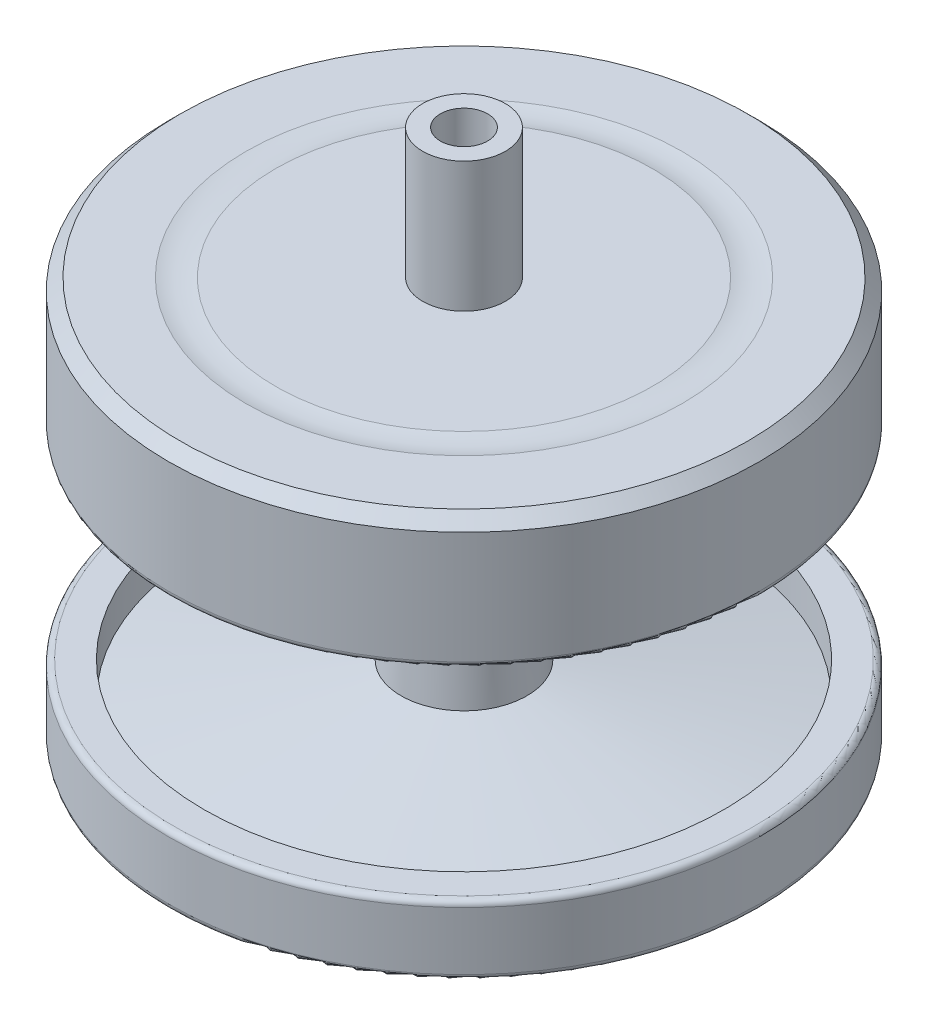
ISO-10303-21;
HEADER;
FILE_DESCRIPTION(('STEP AP214'),'2;1');
FILE_NAME('part.step','',(''),(''),'','','');
FILE_SCHEMA(('AUTOMOTIVE_DESIGN { 1 0 10303 214 1 1 1 1 }'));
ENDSEC;
DATA;
#1=APPLICATION_CONTEXT('core data for automotive mechanical design processes');
#2=APPLICATION_PROTOCOL_DEFINITION('international standard','automotive_design',2000,#1);
#3=PRODUCT_CONTEXT('',#1,'mechanical');
#4=PRODUCT('Part','Part','',(#3));
#5=PRODUCT_RELATED_PRODUCT_CATEGORY('part','',(#4));
#6=PRODUCT_DEFINITION_FORMATION('','',#4);
#7=PRODUCT_DEFINITION_CONTEXT('part definition',#1,'design');
#8=PRODUCT_DEFINITION('design','',#6,#7);
#9=PRODUCT_DEFINITION_SHAPE('','',#8);
#10=(LENGTH_UNIT() NAMED_UNIT(*) SI_UNIT(.MILLI.,.METRE.));
#11=(NAMED_UNIT(*) PLANE_ANGLE_UNIT() SI_UNIT($,.RADIAN.));
#12=(NAMED_UNIT(*) SI_UNIT($,.STERADIAN.) SOLID_ANGLE_UNIT());
#13=UNCERTAINTY_MEASURE_WITH_UNIT(LENGTH_MEASURE(1.E-05),#10,'distance_accuracy_value','');
#14=(GEOMETRIC_REPRESENTATION_CONTEXT(3) GLOBAL_UNCERTAINTY_ASSIGNED_CONTEXT((#13)) GLOBAL_UNIT_ASSIGNED_CONTEXT((#10,
#11,#12)) REPRESENTATION_CONTEXT('',''));
#15=CARTESIAN_POINT('',(0.,0.,0.));
#16=DIRECTION('',(0.,0.,1.));
#17=DIRECTION('',(1.,0.,0.));
#18=AXIS2_PLACEMENT_3D('',#15,#16,#17);
#19=CARTESIAN_POINT('',(3.5,-11.,0.));
#20=DIRECTION('',(0.,-1.,0.));
#21=DIRECTION('',(0.,0.,-1.));
#22=AXIS2_PLACEMENT_3D('',#19,#20,#21);
#23=PLANE('',#22);
#24=CARTESIAN_POINT('',(0.,-11.,0.));
#25=DIRECTION('',(0.,1.,0.));
#26=DIRECTION('',(-1.,0.,0.));
#27=AXIS2_PLACEMENT_3D('',#24,#25,#26);
#28=CIRCLE('',#27,18.4735290069585);
#29=CARTESIAN_POINT('',(-18.4735290069585,-11.,0.));
#30=VERTEX_POINT('',#29);
#31=EDGE_CURVE('E78',#30,#30,#28,.T.);
#32=ORIENTED_EDGE('',*,*,#31,.F.);
#33=EDGE_LOOP('',(#32));
#34=FACE_BOUND('',#33,.T.);
#35=CARTESIAN_POINT('',(0.,-11.,0.));
#36=DIRECTION('',(0.,1.,0.));
#37=DIRECTION('',(-1.,0.,0.));
#38=AXIS2_PLACEMENT_3D('',#35,#36,#37);
#39=CIRCLE('',#38,24.);
#40=CARTESIAN_POINT('',(-24.,-11.,0.));
#41=VERTEX_POINT('',#40);
#42=EDGE_CURVE('E136',#41,#41,#39,.T.);
#43=ORIENTED_EDGE('',*,*,#42,.T.);
#44=EDGE_LOOP('',(#43));
#45=FACE_BOUND('',#44,.T.);
#46=ADVANCED_FACE('F40',(#34,#45),#23,.F.);
#47=CARTESIAN_POINT('',(0.,0.,0.));
#48=DIRECTION('',(0.,1.,0.));
#49=DIRECTION('',(0.,0.,1.));
#50=AXIS2_PLACEMENT_3D('',#47,#48,#49);
#51=CYLINDRICAL_SURFACE('',#50,25.);
#52=CARTESIAN_POINT('',(0.,-21.5,0.));
#53=DIRECTION('',(0.,1.,0.));
#54=DIRECTION('',(0.,0.,1.));
#55=AXIS2_PLACEMENT_3D('',#52,#53,#54);
#56=CIRCLE('',#55,25.);
#57=CARTESIAN_POINT('',(0.,-21.5,25.));
#58=VERTEX_POINT('',#57);
#59=EDGE_CURVE('E48',#58,#58,#56,.T.);
#60=ORIENTED_EDGE('',*,*,#59,.T.);
#61=EDGE_LOOP('',(#60));
#62=FACE_BOUND('',#61,.T.);
#63=CARTESIAN_POINT('',(0.,-12.,0.));
#64=DIRECTION('',(0.,1.,0.));
#65=DIRECTION('',(-1.,0.,0.));
#66=AXIS2_PLACEMENT_3D('',#63,#64,#65);
#67=CIRCLE('',#66,25.);
#68=CARTESIAN_POINT('',(-25.,-12.,0.));
#69=VERTEX_POINT('',#68);
#70=EDGE_CURVE('E132',#69,#69,#67,.T.);
#71=ORIENTED_EDGE('',*,*,#70,.F.);
#72=EDGE_LOOP('',(#71));
#73=FACE_BOUND('',#72,.T.);
#74=ADVANCED_FACE('F159',(#62,#73),#51,.T.);
#75=CARTESIAN_POINT('',(0.,-11.,0.));
#76=DIRECTION('',(0.,1.,0.));
#77=DIRECTION('',(0.,0.,1.));
#78=AXIS2_PLACEMENT_3D('',#75,#76,#77);
#79=CIRCLE('',#78,3.5);
#80=CARTESIAN_POINT('',(0.,-11.,3.5));
#81=VERTEX_POINT('',#80);
#82=EDGE_CURVE('E82',#81,#81,#79,.T.);
#83=ORIENTED_EDGE('',*,*,#82,.F.);
#84=EDGE_LOOP('',(#83));
#85=FACE_BOUND('',#84,.T.);
#86=CARTESIAN_POINT('',(0.,-11.,0.));
#87=DIRECTION('',(0.,1.,0.));
#88=DIRECTION('',(-1.,0.,0.));
#89=AXIS2_PLACEMENT_3D('',#86,#87,#88);
#90=CIRCLE('',#89,15.9577184371305);
#91=CARTESIAN_POINT('',(-15.9577184371305,-11.,0.));
#92=VERTEX_POINT('',#91);
#93=EDGE_CURVE('E128',#92,#92,#90,.T.);
#94=ORIENTED_EDGE('',*,*,#93,.T.);
#95=EDGE_LOOP('',(#94));
#96=FACE_BOUND('',#95,.T.);
#97=ADVANCED_FACE('F162',(#85,#96),#23,.F.);
#98=CARTESIAN_POINT('',(0.,-42.,0.));
#99=DIRECTION('',(0.,1.,0.));
#100=DIRECTION('',(0.,0.,1.));
#101=AXIS2_PLACEMENT_3D('',#98,#99,#100);
#102=TOROIDAL_SURFACE('',#101,6.50000000000001,3.);
#103=CARTESIAN_POINT('',(0.,-42.,0.));
#104=DIRECTION('',(0.,1.,0.));
#105=DIRECTION('',(0.,0.,1.));
#106=AXIS2_PLACEMENT_3D('',#103,#104,#105);
#107=CIRCLE('',#106,3.50000000000001);
#108=CARTESIAN_POINT('',(0.,-42.,3.50000000000001));
#109=VERTEX_POINT('',#108);
#110=EDGE_CURVE('E110',#109,#109,#107,.T.);
#111=ORIENTED_EDGE('',*,*,#110,.T.);
#112=EDGE_LOOP('',(#111));
#113=FACE_BOUND('',#112,.T.);
#114=CARTESIAN_POINT('',(0.,-43.0432354672568,0.));
#115=DIRECTION('',(0.,1.,0.));
#116=DIRECTION('',(-1.,0.,0.));
#117=AXIS2_PLACEMENT_3D('',#114,#115,#116);
#118=CIRCLE('',#117,3.68723272205866);
#119=CARTESIAN_POINT('',(3.68723272206003,-43.0432354672568,0.));
#120=VERTEX_POINT('',#119);
#121=EDGE_CURVE('E73',#120,#120,#118,.T.);
#122=ORIENTED_EDGE('',*,*,#121,.F.);
#123=EDGE_LOOP('',(#122));
#124=FACE_BOUND('',#123,.T.);
#125=ADVANCED_FACE('F170',(#113,#124),#102,.T.);
#126=CARTESIAN_POINT('',(2.,0.,0.));
#127=DIRECTION('',(0.,-1.,0.));
#128=DIRECTION('',(0.,0.,-1.));
#129=AXIS2_PLACEMENT_3D('',#126,#127,#128);
#130=PLANE('',#129);
#131=CARTESIAN_POINT('',(0.,0.,0.));
#132=DIRECTION('',(0.,1.,0.));
#133=DIRECTION('',(0.,0.,1.));
#134=AXIS2_PLACEMENT_3D('',#131,#132,#133);
#135=CIRCLE('',#134,2.);
#136=CARTESIAN_POINT('',(0.,0.,2.));
#137=VERTEX_POINT('',#136);
#138=EDGE_CURVE('E77',#137,#137,#135,.T.);
#139=ORIENTED_EDGE('',*,*,#138,.F.);
#140=EDGE_LOOP('',(#139));
#141=FACE_BOUND('',#140,.T.);
#142=CARTESIAN_POINT('',(0.,0.,0.));
#143=DIRECTION('',(0.,1.,0.));
#144=DIRECTION('',(0.,0.,1.));
#145=AXIS2_PLACEMENT_3D('',#142,#143,#144);
#146=CIRCLE('',#145,3.5);
#147=CARTESIAN_POINT('',(0.,0.,3.5));
#148=VERTEX_POINT('',#147);
#149=EDGE_CURVE('E72',#148,#148,#146,.T.);
#150=ORIENTED_EDGE('',*,*,#149,.T.);
#151=EDGE_LOOP('',(#150));
#152=FACE_BOUND('',#151,.T.);
#153=ADVANCED_FACE('F175',(#141,#152),#130,.F.);
#154=CARTESIAN_POINT('',(0.,0.,0.));
#155=DIRECTION('',(0.,1.,0.));
#156=DIRECTION('',(0.,0.,1.));
#157=AXIS2_PLACEMENT_3D('',#154,#155,#156);
#158=CYLINDRICAL_SURFACE('',#157,3.5);
#159=ORIENTED_EDGE('',*,*,#149,.F.);
#160=EDGE_LOOP('',(#159));
#161=FACE_BOUND('',#160,.T.);
#162=ORIENTED_EDGE('',*,*,#82,.T.);
#163=EDGE_LOOP('',(#162));
#164=FACE_BOUND('',#163,.T.);
#165=ADVANCED_FACE('F183',(#161,#164),#158,.T.);
#166=CARTESIAN_POINT('',(25.,-22.,0.));
#167=DIRECTION('',(0.,1.,0.));
#168=DIRECTION('',(0.,0.,1.));
#169=AXIS2_PLACEMENT_3D('',#166,#167,#168);
#170=PLANE('',#169);
#171=CARTESIAN_POINT('',(0.,-22.,0.));
#172=DIRECTION('',(0.,1.,0.));
#173=DIRECTION('',(0.,0.,1.));
#174=AXIS2_PLACEMENT_3D('',#171,#172,#173);
#175=CIRCLE('',#174,24.5);
#176=CARTESIAN_POINT('',(0.,-22.,24.5));
#177=VERTEX_POINT('',#176);
#178=EDGE_CURVE('E10',#177,#177,#175,.F.);
#179=ORIENTED_EDGE('',*,*,#178,.T.);
#180=EDGE_LOOP('',(#179));
#181=FACE_BOUND('',#180,.T.);
#182=CARTESIAN_POINT('',(0.,-22.,0.));
#183=DIRECTION('',(0.,1.,0.));
#184=DIRECTION('',(0.,0.,1.));
#185=AXIS2_PLACEMENT_3D('',#182,#183,#184);
#186=CIRCLE('',#185,22.);
#187=CARTESIAN_POINT('',(0.,-22.,22.));
#188=VERTEX_POINT('',#187);
#189=EDGE_CURVE('E86',#188,#188,#186,.T.);
#190=ORIENTED_EDGE('',*,*,#189,.T.);
#191=EDGE_LOOP('',(#190));
#192=FACE_BOUND('',#191,.T.);
#193=ADVANCED_FACE('F185',(#181,#192),#170,.F.);
#194=CARTESIAN_POINT('',(0.,0.,0.));
#195=DIRECTION('',(0.,1.,0.));
#196=DIRECTION('',(0.,0.,1.));
#197=AXIS2_PLACEMENT_3D('',#194,#195,#196);
#198=CYLINDRICAL_SURFACE('',#197,22.);
#199=ORIENTED_EDGE('',*,*,#189,.F.);
#200=EDGE_LOOP('',(#199));
#201=FACE_BOUND('',#200,.T.);
#202=CARTESIAN_POINT('',(0.,-14.,0.));
#203=DIRECTION('',(0.,1.,0.));
#204=DIRECTION('',(0.,0.,1.));
#205=AXIS2_PLACEMENT_3D('',#202,#203,#204);
#206=CIRCLE('',#205,22.);
#207=CARTESIAN_POINT('',(0.,-14.,22.));
#208=VERTEX_POINT('',#207);
#209=EDGE_CURVE('E90',#208,#208,#206,.T.);
#210=ORIENTED_EDGE('',*,*,#209,.T.);
#211=EDGE_LOOP('',(#210));
#212=FACE_BOUND('',#211,.T.);
#213=ADVANCED_FACE('F191',(#201,#212),#198,.F.);
#214=CARTESIAN_POINT('',(22.,-14.,0.));
#215=DIRECTION('',(0.,1.,0.));
#216=DIRECTION('',(0.,0.,1.));
#217=AXIS2_PLACEMENT_3D('',#214,#215,#216);
#218=PLANE('',#217);
#219=ORIENTED_EDGE('',*,*,#209,.F.);
#220=EDGE_LOOP('',(#219));
#221=FACE_BOUND('',#220,.T.);
#222=CARTESIAN_POINT('',(0.,-14.,0.));
#223=DIRECTION('',(0.,1.,0.));
#224=DIRECTION('',(0.,0.,1.));
#225=AXIS2_PLACEMENT_3D('',#222,#223,#224);
#226=CIRCLE('',#225,3.5);
#227=CARTESIAN_POINT('',(0.,-14.,3.5));
#228=VERTEX_POINT('',#227);
#229=EDGE_CURVE('E94',#228,#228,#226,.T.);
#230=ORIENTED_EDGE('',*,*,#229,.T.);
#231=EDGE_LOOP('',(#230));
#232=FACE_BOUND('',#231,.T.);
#233=ADVANCED_FACE('F229',(#221,#232),#218,.F.);
#234=CARTESIAN_POINT('',(0.,-39.,0.));
#235=DIRECTION('',(0.,-1.,0.));
#236=DIRECTION('',(0.,0.,-1.));
#237=AXIS2_PLACEMENT_3D('',#234,#235,#236);
#238=CONICAL_SURFACE('',#237,5.3229608751464,0.0727896075906363);
#239=ORIENTED_EDGE('',*,*,#229,.F.);
#240=EDGE_LOOP('',(#239));
#241=FACE_BOUND('',#240,.T.);
#242=CARTESIAN_POINT('',(0.,-39.,0.));
#243=DIRECTION('',(0.,1.,0.));
#244=DIRECTION('',(0.,0.,1.));
#245=AXIS2_PLACEMENT_3D('',#242,#243,#244);
#246=CIRCLE('',#245,5.3229608751464);
#247=CARTESIAN_POINT('',(0.,-39.,-5.32296087514643));
#248=VERTEX_POINT('',#247);
#249=EDGE_CURVE('E98',#248,#248,#246,.T.);
#250=ORIENTED_EDGE('',*,*,#249,.T.);
#251=EDGE_LOOP('',(#250));
#252=FACE_BOUND('',#251,.T.);
#253=ADVANCED_FACE('F221',(#241,#252),#238,.T.);
#254=CARTESIAN_POINT('',(0.,-42.,0.));
#255=DIRECTION('',(0.,-1.,0.));
#256=DIRECTION('',(0.,0.,-1.));
#257=AXIS2_PLACEMENT_3D('',#254,#255,#256);
#258=CONICAL_SURFACE('',#257,22.,1.39281183011702);
#259=CARTESIAN_POINT('',(0.,-42.,0.));
#260=DIRECTION('',(0.,1.,0.));
#261=DIRECTION('',(0.,0.,1.));
#262=AXIS2_PLACEMENT_3D('',#259,#260,#261);
#263=CIRCLE('',#262,22.);
#264=CARTESIAN_POINT('',(0.,-42.,-22.));
#265=VERTEX_POINT('',#264);
#266=EDGE_CURVE('E102',#265,#265,#263,.T.);
#267=CARTESIAN_POINT('',(0.,-39.,-5.32296087514643));
#268=CARTESIAN_POINT('',(0.,-39.03125,-5.49668003269699));
#269=CARTESIAN_POINT('',(0.,-39.0625,-5.67039919024754));
#270=CARTESIAN_POINT('',(0.,-39.125,-6.01783750534866));
#271=CARTESIAN_POINT('',(0.,-39.15625,-6.19155666289922));
#272=CARTESIAN_POINT('',(0.,-39.21875,-6.53899497800034));
#273=CARTESIAN_POINT('',(0.,-39.25,-6.71271413555089));
#274=CARTESIAN_POINT('',(0.,-39.3125,-7.06015245065201));
#275=CARTESIAN_POINT('',(0.,-39.34375,-7.23387160820257));
#276=CARTESIAN_POINT('',(0.,-39.40625,-7.58130992330369));
#277=CARTESIAN_POINT('',(0.,-39.4375,-7.75502908085424));
#278=CARTESIAN_POINT('',(0.,-39.5,-8.10246739595536));
#279=CARTESIAN_POINT('',(0.,-39.53125,-8.27618655350592));
#280=CARTESIAN_POINT('',(0.,-39.59375,-8.62362486860703));
#281=CARTESIAN_POINT('',(0.,-39.625,-8.79734402615759));
#282=CARTESIAN_POINT('',(0.,-39.6875,-9.14478234125871));
#283=CARTESIAN_POINT('',(0.,-39.71875,-9.31850149880927));
#284=CARTESIAN_POINT('',(0.,-39.78125,-9.66593981391039));
#285=CARTESIAN_POINT('',(0.,-39.8125,-9.83965897146094));
#286=CARTESIAN_POINT('',(0.,-39.875,-10.1870972865621));
#287=CARTESIAN_POINT('',(0.,-39.90625,-10.3608164441126));
#288=CARTESIAN_POINT('',(0.,-39.96875,-10.7082547592137));
#289=CARTESIAN_POINT('',(0.,-40.,-10.8819739167643));
#290=CARTESIAN_POINT('',(0.,-40.0625,-11.2294122318654));
#291=CARTESIAN_POINT('',(0.,-40.09375,-11.403131389416));
#292=CARTESIAN_POINT('',(0.,-40.15625,-11.7505697045171));
#293=CARTESIAN_POINT('',(0.,-40.1875,-11.9242888620676));
#294=CARTESIAN_POINT('',(0.,-40.25,-12.2717271771688));
#295=CARTESIAN_POINT('',(0.,-40.28125,-12.4454463347193));
#296=CARTESIAN_POINT('',(0.,-40.34375,-12.7928846498204));
#297=CARTESIAN_POINT('',(0.,-40.375,-12.966603807371));
#298=CARTESIAN_POINT('',(0.,-40.4375,-13.3140421224721));
#299=CARTESIAN_POINT('',(0.,-40.46875,-13.4877612800227));
#300=CARTESIAN_POINT('',(0.,-40.53125,-13.8351995951238));
#301=CARTESIAN_POINT('',(0.,-40.5625,-14.0089187526743));
#302=CARTESIAN_POINT('',(0.,-40.625,-14.3563570677755));
#303=CARTESIAN_POINT('',(0.,-40.65625,-14.530076225326));
#304=CARTESIAN_POINT('',(0.,-40.71875,-14.8775145404271));
#305=CARTESIAN_POINT('',(0.,-40.75,-15.0512336979777));
#306=CARTESIAN_POINT('',(0.,-40.8125,-15.3986720130788));
#307=CARTESIAN_POINT('',(0.,-40.84375,-15.5723911706294));
#308=CARTESIAN_POINT('',(0.,-40.90625,-15.9198294857305));
#309=CARTESIAN_POINT('',(0.,-40.9375,-16.093548643281));
#310=CARTESIAN_POINT('',(0.,-41.,-16.4409869583822));
#311=CARTESIAN_POINT('',(0.,-41.03125,-16.6147061159327));
#312=CARTESIAN_POINT('',(0.,-41.09375,-16.9621444310338));
#313=CARTESIAN_POINT('',(0.,-41.125,-17.1358635885844));
#314=CARTESIAN_POINT('',(0.,-41.1875,-17.4833019036855));
#315=CARTESIAN_POINT('',(0.,-41.21875,-17.6570210612361));
#316=CARTESIAN_POINT('',(0.,-41.28125,-18.0044593763372));
#317=CARTESIAN_POINT('',(0.,-41.3125,-18.1781785338877));
#318=CARTESIAN_POINT('',(0.,-41.375,-18.5256168489889));
#319=CARTESIAN_POINT('',(0.,-41.40625,-18.6993360065394));
#320=CARTESIAN_POINT('',(0.,-41.46875,-19.0467743216405));
#321=CARTESIAN_POINT('',(0.,-41.5,-19.2204934791911));
#322=CARTESIAN_POINT('',(0.,-41.5625,-19.5679317942922));
#323=CARTESIAN_POINT('',(0.,-41.59375,-19.7416509518428));
#324=CARTESIAN_POINT('',(0.,-41.65625,-20.0890892669439));
#325=CARTESIAN_POINT('',(0.,-41.6875,-20.2628084244944));
#326=CARTESIAN_POINT('',(0.,-41.75,-20.6102467395956));
#327=CARTESIAN_POINT('',(0.,-41.78125,-20.7839658971461));
#328=CARTESIAN_POINT('',(0.,-41.84375,-21.1314042122472));
#329=CARTESIAN_POINT('',(0.,-41.875,-21.3051233697978));
#330=CARTESIAN_POINT('',(0.,-41.9375,-21.6525616848989));
#331=CARTESIAN_POINT('',(0.,-41.96875,-21.8262808424495));
#332=CARTESIAN_POINT('',(0.,-42.,-22.));
#333=B_SPLINE_CURVE_WITH_KNOTS('',3,(#267,#268,#269,#270,#271,#272,#273,#274,#275,#276,#277,
#278,#279,#280,#281,#282,#283,#284,#285,#286,#287,#288,#289,#290,#291,#292,#293,#294,#295,#296,
#297,#298,#299,#300,#301,#302,#303,#304,#305,#306,#307,#308,#309,#310,#311,#312,#313,#314,#315,
#316,#317,#318,#319,#320,#321,#322,#323,#324,#325,#326,#327,#328,#329,#330,#331,#332),
.UNSPECIFIED.,.F.,.F.,(4,2,2,2,2,2,2,2,2,2,2,2,2,2,2,2,2,2,2,2,2,2,2,2,2,2,2,2,2,2,2,2,4),(0.,
0.529522590453588,1.05904518090718,1.58856777136077,2.11809036181436,2.64761295226795,
3.17713554272154,3.70665813317513,4.23618072362873,4.76570331408232,5.29522590453591,
5.8247484949895,6.35427108544309,6.88379367589668,7.41331626635027,7.94283885680386,
8.47236144725745,9.00188403771104,9.53140662816463,10.0609292186182,10.5904518090718,
11.1199743995254,11.649496989979,12.1790195804326,12.7085421708862,13.2380647613398,
13.7675873517934,14.297109942247,14.8266325327005,15.3561551231541,15.8856777136077,
16.4152003040613,16.9447228945149),.UNSPECIFIED.);
#334=EDGE_CURVE('BSEAM215',#248,#265,#333,.T.);
#335=ORIENTED_EDGE('',*,*,#249,.F.);
#336=ORIENTED_EDGE('',*,*,#266,.T.);
#337=ORIENTED_EDGE('',*,*,#334,.T.);
#338=ORIENTED_EDGE('',*,*,#334,.F.);
#339=EDGE_LOOP('',(#335,#337,#336,#338));
#340=FACE_BOUND('',#339,.T.);
#341=ADVANCED_FACE('F215',(#340),#258,.T.);
#342=CARTESIAN_POINT('',(0.,0.,0.));
#343=DIRECTION('',(0.,1.,0.));
#344=DIRECTION('',(0.,0.,1.));
#345=AXIS2_PLACEMENT_3D('',#342,#343,#344);
#346=CYLINDRICAL_SURFACE('',#345,22.);
#347=ORIENTED_EDGE('',*,*,#266,.F.);
#348=EDGE_LOOP('',(#347));
#349=FACE_BOUND('',#348,.T.);
#350=CARTESIAN_POINT('',(0.,-39.,0.));
#351=DIRECTION('',(0.,1.,0.));
#352=DIRECTION('',(0.,0.,1.));
#353=AXIS2_PLACEMENT_3D('',#350,#351,#352);
#354=CIRCLE('',#353,22.);
#355=CARTESIAN_POINT('',(0.,-39.,22.));
#356=VERTEX_POINT('',#355);
#357=EDGE_CURVE('E106',#356,#356,#354,.T.);
#358=ORIENTED_EDGE('',*,*,#357,.T.);
#359=EDGE_LOOP('',(#358));
#360=FACE_BOUND('',#359,.T.);
#361=ADVANCED_FACE('F210',(#349,#360),#346,.F.);
#362=CARTESIAN_POINT('',(22.,-39.,0.));
#363=DIRECTION('',(0.,-1.,0.));
#364=DIRECTION('',(0.,0.,-1.));
#365=AXIS2_PLACEMENT_3D('',#362,#363,#364);
#366=PLANE('',#365);
#367=CARTESIAN_POINT('',(0.,-39.,0.));
#368=DIRECTION('',(0.,-1.,0.));
#369=DIRECTION('',(0.,0.,-1.));
#370=AXIS2_PLACEMENT_3D('',#367,#368,#369);
#371=CIRCLE('',#370,24.5);
#372=CARTESIAN_POINT('',(0.,-39.,-24.5));
#373=VERTEX_POINT('',#372);
#374=EDGE_CURVE('E53',#373,#373,#371,.F.);
#375=ORIENTED_EDGE('',*,*,#374,.T.);
#376=EDGE_LOOP('',(#375));
#377=FACE_BOUND('',#376,.T.);
#378=ORIENTED_EDGE('',*,*,#357,.F.);
#379=EDGE_LOOP('',(#378));
#380=FACE_BOUND('',#379,.T.);
#381=ADVANCED_FACE('F206',(#377,#380),#366,.F.);
#382=CARTESIAN_POINT('',(0.,0.,0.));
#383=DIRECTION('',(0.,1.,0.));
#384=DIRECTION('',(0.,0.,1.));
#385=AXIS2_PLACEMENT_3D('',#382,#383,#384);
#386=CYLINDRICAL_SURFACE('',#385,25.);
#387=CARTESIAN_POINT('',(0.,-44.4141488616948,0.));
#388=DIRECTION('',(0.,-1.,0.));
#389=DIRECTION('',(0.,0.,-1.));
#390=AXIS2_PLACEMENT_3D('',#387,#388,#389);
#391=CIRCLE('',#390,25.);
#392=CARTESIAN_POINT('',(0.,-44.4141488616948,-25.));
#393=VERTEX_POINT('',#392);
#394=EDGE_CURVE('E64',#393,#393,#391,.F.);
#395=ORIENTED_EDGE('',*,*,#394,.T.);
#396=EDGE_LOOP('',(#395));
#397=FACE_BOUND('',#396,.T.);
#398=CARTESIAN_POINT('',(0.,-39.5,0.));
#399=DIRECTION('',(0.,-1.,0.));
#400=DIRECTION('',(0.,0.,-1.));
#401=AXIS2_PLACEMENT_3D('',#398,#399,#400);
#402=CIRCLE('',#401,25.);
#403=CARTESIAN_POINT('',(0.,-39.5,-25.));
#404=VERTEX_POINT('',#403);
#405=EDGE_CURVE('E68',#404,#404,#402,.T.);
#406=ORIENTED_EDGE('',*,*,#405,.T.);
#407=EDGE_LOOP('',(#406));
#408=FACE_BOUND('',#407,.T.);
#409=ADVANCED_FACE('F209',(#397,#408),#386,.T.);
#410=CARTESIAN_POINT('',(0.,0.,0.));
#411=DIRECTION('',(0.,1.,0.));
#412=DIRECTION('',(0.,0.,1.));
#413=AXIS2_PLACEMENT_3D('',#410,#411,#412);
#414=CYLINDRICAL_SURFACE('',#413,3.5);
#415=ORIENTED_EDGE('',*,*,#110,.F.);
#416=EDGE_LOOP('',(#415));
#417=FACE_BOUND('',#416,.T.);
#418=CARTESIAN_POINT('',(0.,-27.,0.));
#419=DIRECTION('',(0.,1.,0.));
#420=DIRECTION('',(0.,0.,1.));
#421=AXIS2_PLACEMENT_3D('',#418,#419,#420);
#422=CIRCLE('',#421,3.5);
#423=CARTESIAN_POINT('',(0.,-27.,3.5));
#424=VERTEX_POINT('',#423);
#425=EDGE_CURVE('E114',#424,#424,#422,.T.);
#426=ORIENTED_EDGE('',*,*,#425,.T.);
#427=EDGE_LOOP('',(#426));
#428=FACE_BOUND('',#427,.T.);
#429=ADVANCED_FACE('F271',(#417,#428),#414,.F.);
#430=CARTESIAN_POINT('',(2.,-27.,0.));
#431=DIRECTION('',(0.,1.,0.));
#432=DIRECTION('',(0.,0.,1.));
#433=AXIS2_PLACEMENT_3D('',#430,#431,#432);
#434=PLANE('',#433);
#435=ORIENTED_EDGE('',*,*,#425,.F.);
#436=EDGE_LOOP('',(#435));
#437=FACE_BOUND('',#436,.T.);
#438=CARTESIAN_POINT('',(0.,-27.,0.));
#439=DIRECTION('',(0.,1.,0.));
#440=DIRECTION('',(0.,0.,1.));
#441=AXIS2_PLACEMENT_3D('',#438,#439,#440);
#442=CIRCLE('',#441,2.);
#443=CARTESIAN_POINT('',(0.,-27.,2.));
#444=VERTEX_POINT('',#443);
#445=EDGE_CURVE('E118',#444,#444,#442,.T.);
#446=ORIENTED_EDGE('',*,*,#445,.T.);
#447=EDGE_LOOP('',(#446));
#448=FACE_BOUND('',#447,.T.);
#449=ADVANCED_FACE('F276',(#437,#448),#434,.F.);
#450=CARTESIAN_POINT('',(0.,0.,0.));
#451=DIRECTION('',(0.,1.,0.));
#452=DIRECTION('',(0.,0.,1.));
#453=AXIS2_PLACEMENT_3D('',#450,#451,#452);
#454=CYLINDRICAL_SURFACE('',#453,2.);
#455=ORIENTED_EDGE('',*,*,#445,.F.);
#456=EDGE_LOOP('',(#455));
#457=FACE_BOUND('',#456,.T.);
#458=ORIENTED_EDGE('',*,*,#138,.T.);
#459=EDGE_LOOP('',(#458));
#460=FACE_BOUND('',#459,.T.);
#461=ADVANCED_FACE('F288',(#457,#460),#454,.F.);
#462=CARTESIAN_POINT('',(0.,-200.249999999999,0.));
#463=DIRECTION('',(0.,1.,0.));
#464=DIRECTION('',(1.,0.,0.));
#465=AXIS2_PLACEMENT_3D('',#462,#463,#464);
#466=SPHERICAL_SURFACE('',#465,157.249999999999);
#467=CARTESIAN_POINT('',(0.,-44.9080818288527,0.));
#468=DIRECTION('',(0.,-1.,0.));
#469=DIRECTION('',(0.,0.,-1.));
#470=AXIS2_PLACEMENT_3D('',#467,#468,#469);
#471=CIRCLE('',#470,24.4223454833597);
#472=CARTESIAN_POINT('',(24.4223454833598,-44.9080818288527,0.));
#473=VERTEX_POINT('',#472);
#474=EDGE_CURVE('E58',#473,#473,#471,.T.);
#475=CARTESIAN_POINT('',(24.4223454833598,-44.9080818288527,0.));
#476=CARTESIAN_POINT('',(24.2079576093416,-44.8743764695829,0.));
#477=CARTESIAN_POINT('',(23.993499959195,-44.8411149317616,0.));
#478=CARTESIAN_POINT('',(23.5644487847447,-44.7754800571816,0.));
#479=CARTESIAN_POINT('',(23.3498552604409,-44.7431067204229,0.));
#480=CARTESIAN_POINT('',(22.9205360157761,-44.6792488061341,0.));
#481=CARTESIAN_POINT('',(22.705810295415,-44.6477642286039,0.));
#482=CARTESIAN_POINT('',(22.2762303396253,-44.5856843716229,0.));
#483=CARTESIAN_POINT('',(22.0613761041967,-44.5550890921721,0.));
#484=CARTESIAN_POINT('',(21.6315428012977,-44.4947883560493,0.));
#485=CARTESIAN_POINT('',(21.4165637338273,-44.4650828993773,0.));
#486=CARTESIAN_POINT('',(20.9864844520551,-44.4065623179653,0.));
#487=CARTESIAN_POINT('',(20.7713842377534,-44.3777471932254,0.));
#488=CARTESIAN_POINT('',(20.3410663495936,-44.3210077696469,0.));
#489=CARTESIAN_POINT('',(20.1258486757356,-44.2930834708084,0.));
#490=CARTESIAN_POINT('',(19.6952995577552,-44.2381261777105,0.));
#491=CARTESIAN_POINT('',(19.4799681136329,-44.2110931834512,0.));
#492=CARTESIAN_POINT('',(19.0491951463649,-44.1579189629163,0.));
#493=CARTESIAN_POINT('',(18.8337536232194,-44.1317777366407,0.));
#494=CARTESIAN_POINT('',(18.4027641910336,-44.0803875001895,0.));
#495=CARTESIAN_POINT('',(18.1872162819934,-44.0551384900138,0.));
#496=CARTESIAN_POINT('',(17.7560177729703,-44.0055331185845,0.));
#497=CARTESIAN_POINT('',(17.5403671729875,-43.9811767573309,0.));
#498=CARTESIAN_POINT('',(17.1089669787918,-43.9333571012658,0.));
#499=CARTESIAN_POINT('',(16.8932173845788,-43.9098938064543,0.));
#500=CARTESIAN_POINT('',(16.4616229003322,-43.8638606854846,0.));
#501=CARTESIAN_POINT('',(16.2457780102985,-43.8412908593263,0.));
#502=CARTESIAN_POINT('',(15.8139966344534,-43.797045062558,0.));
#503=CARTESIAN_POINT('',(15.5980601486421,-43.775369091948,0.));
#504=CARTESIAN_POINT('',(15.1660992828547,-43.7329113778487,0.));
#505=CARTESIAN_POINT('',(14.9500749028787,-43.7121296343594,0.));
#506=CARTESIAN_POINT('',(14.517941951882,-43.6714607307452,0.));
#507=CARTESIAN_POINT('',(14.3018333808612,-43.6515735706203,0.));
#508=CARTESIAN_POINT('',(13.869535752338,-43.6126941746431,0.));
#509=CARTESIAN_POINT('',(13.6533466948356,-43.5937019387909,0.));
#510=CARTESIAN_POINT('',(13.2208917992917,-43.5566127169267,0.));
#511=CARTESIAN_POINT('',(13.0046259612503,-43.5385157309148,0.));
#512=CARTESIAN_POINT('',(12.5720212118875,-43.5032173189522,0.));
#513=CARTESIAN_POINT('',(12.3556823005661,-43.4860158930016,0.));
#514=CARTESIAN_POINT('',(11.9229351131549,-43.4525088960309,0.));
#515=CARTESIAN_POINT('',(11.7065268370651,-43.4362033250108,0.));
#516=CARTESIAN_POINT('',(11.2736446298176,-43.4044883174136,0.));
#517=CARTESIAN_POINT('',(11.05717069866,-43.3890788808364,0.));
#518=CARTESIAN_POINT('',(10.624160892103,-43.3591564062756,0.));
#519=CARTESIAN_POINT('',(10.4076250167037,-43.3446433682921,0.));
#520=CARTESIAN_POINT('',(9.97449503355135,-43.316513939703,0.));
#521=CARTESIAN_POINT('',(9.75790092579829,-43.3028975490975,0.));
#522=CARTESIAN_POINT('',(9.32465819082463,-43.2765616486787,0.));
#523=CARTESIAN_POINT('',(9.10800956360402,-43.2638421388654,0.));
#524=CARTESIAN_POINT('',(8.67466150351604,-43.2393002180706,0.));
#525=CARTESIAN_POINT('',(8.45796207064866,-43.2274778070892,0.));
#526=CARTESIAN_POINT('',(8.02451611395882,-43.2047302866187,0.));
#527=CARTESIAN_POINT('',(7.80776959013635,-43.1938051771296,0.));
#528=CARTESIAN_POINT('',(7.37423316703516,-43.1728524469277,0.));
#529=CARTESIAN_POINT('',(7.15744326775642,-43.162824826215,0.));
#530=CARTESIAN_POINT('',(6.72382380998562,-43.1436672454441,0.));
#531=CARTESIAN_POINT('',(6.50699425149355,-43.134537285386,0.));
#532=CARTESIAN_POINT('',(6.07329919221667,-43.1171751824938,0.));
#533=CARTESIAN_POINT('',(5.85643369143185,-43.1089430396597,0.));
#534=CARTESIAN_POINT('',(5.42267046511437,-43.0933767120988,0.));
#535=CARTESIAN_POINT('',(5.20577273958171,-43.0860425273719,0.));
#536=CARTESIAN_POINT('',(4.7719487818353,-43.0722722426207,0.));
#537=CARTESIAN_POINT('',(4.55502254962155,-43.0658361425963,0.));
#538=CARTESIAN_POINT('',(4.12114529718229,-43.0538621343248,0.));
#539=CARTESIAN_POINT('',(3.90419427695677,-43.0483242260778,0.));
#540=CARTESIAN_POINT('',(3.68723272206003,-43.0432354672568,0.));
#541=B_SPLINE_CURVE_WITH_KNOTS('',3,(#475,#476,#477,#478,#479,#480,#481,#482,#483,#484,#485,
#486,#487,#488,#489,#490,#491,#492,#493,#494,#495,#496,#497,#498,#499,#500,#501,#502,#503,#504,
#505,#506,#507,#508,#509,#510,#511,#512,#513,#514,#515,#516,#517,#518,#519,#520,#521,#522,#523,
#524,#525,#526,#527,#528,#529,#530,#531,#532,#533,#534,#535,#536,#537,#538,#539,#540),
.UNSPECIFIED.,.F.,.F.,(4,2,2,2,2,2,2,2,2,2,2,2,2,2,2,2,2,2,2,2,2,2,2,2,2,2,2,2,2,2,2,2,4),(0.,
0.651063207652718,1.30212641530544,1.95318962295813,2.60425283061085,3.25531603826358,
3.9063792459163,4.55744245356902,5.20850566122171,5.85956886887443,6.51063207652715,
7.16169528417988,7.8127584918326,8.46382169948532,9.11488490713801,9.76594811479073,
10.4170113224435,11.0680745300962,11.7191377377489,12.3702009454016,13.0212641530543,
13.672327360707,14.3233905683598,14.9744537760125,15.6255169836652,16.2765801913179,
16.9276433989706,17.5787066066233,18.2297698142761,18.8808330219288,19.5318962295815,
20.1829594372342,20.8340226448869),.UNSPECIFIED.);
#542=EDGE_CURVE('BSEAM155',#473,#120,#541,.T.);
#543=ORIENTED_EDGE('',*,*,#474,.T.);
#544=ORIENTED_EDGE('',*,*,#121,.T.);
#545=ORIENTED_EDGE('',*,*,#542,.T.);
#546=ORIENTED_EDGE('',*,*,#542,.F.);
#547=EDGE_LOOP('',(#543,#545,#544,#546));
#548=FACE_BOUND('',#547,.T.);
#549=ADVANCED_FACE('F155',(#548),#466,.F.);
#550=CARTESIAN_POINT('',(0.,-5.64422479184383,0.));
#551=DIRECTION('',(0.,1.,0.));
#552=DIRECTION('',(-1.,0.,0.));
#553=AXIS2_PLACEMENT_3D('',#550,#551,#552);
#554=TOROIDAL_SURFACE('',#553,17.2156237220445,5.50151377223713);
#555=ORIENTED_EDGE('',*,*,#31,.T.);
#556=EDGE_LOOP('',(#555));
#557=FACE_BOUND('',#556,.T.);
#558=ORIENTED_EDGE('',*,*,#93,.F.);
#559=EDGE_LOOP('',(#558));
#560=FACE_BOUND('',#559,.T.);
#561=ADVANCED_FACE('F145',(#557,#560),#554,.F.);
#562=CARTESIAN_POINT('',(0.,-11.,0.));
#563=DIRECTION('',(0.,-1.,0.));
#564=DIRECTION('',(1.,0.,0.));
#565=AXIS2_PLACEMENT_3D('',#562,#563,#564);
#566=CONICAL_SURFACE('',#565,24.,0.785398163397448);
#567=ORIENTED_EDGE('',*,*,#70,.T.);
#568=EDGE_LOOP('',(#567));
#569=FACE_BOUND('',#568,.T.);
#570=ORIENTED_EDGE('',*,*,#42,.F.);
#571=EDGE_LOOP('',(#570));
#572=FACE_BOUND('',#571,.T.);
#573=ADVANCED_FACE('F142',(#569,#572),#566,.T.);
#574=CARTESIAN_POINT('',(0.,-44.4141488616948,0.));
#575=DIRECTION('',(0.,-1.,0.));
#576=DIRECTION('',(0.,0.,-1.));
#577=AXIS2_PLACEMENT_3D('',#574,#575,#576);
#578=TOROIDAL_SURFACE('',#577,24.5,0.5);
#579=ORIENTED_EDGE('',*,*,#474,.F.);
#580=EDGE_LOOP('',(#579));
#581=FACE_BOUND('',#580,.T.);
#582=ORIENTED_EDGE('',*,*,#394,.F.);
#583=EDGE_LOOP('',(#582));
#584=FACE_BOUND('',#583,.T.);
#585=ADVANCED_FACE('F144',(#581,#584),#578,.T.);
#586=CARTESIAN_POINT('',(0.,-39.5,0.));
#587=DIRECTION('',(0.,-1.,0.));
#588=DIRECTION('',(0.,0.,-1.));
#589=AXIS2_PLACEMENT_3D('',#586,#587,#588);
#590=TOROIDAL_SURFACE('',#589,24.5,0.5);
#591=ORIENTED_EDGE('',*,*,#405,.F.);
#592=EDGE_LOOP('',(#591));
#593=FACE_BOUND('',#592,.T.);
#594=ORIENTED_EDGE('',*,*,#374,.F.);
#595=EDGE_LOOP('',(#594));
#596=FACE_BOUND('',#595,.T.);
#597=ADVANCED_FACE('F152',(#593,#596),#590,.T.);
#598=CARTESIAN_POINT('',(0.,-21.5,0.));
#599=DIRECTION('',(0.,1.,0.));
#600=DIRECTION('',(0.,0.,1.));
#601=AXIS2_PLACEMENT_3D('',#598,#599,#600);
#602=TOROIDAL_SURFACE('',#601,24.5,0.5);
#603=ORIENTED_EDGE('',*,*,#178,.F.);
#604=EDGE_LOOP('',(#603));
#605=FACE_BOUND('',#604,.T.);
#606=ORIENTED_EDGE('',*,*,#59,.F.);
#607=EDGE_LOOP('',(#606));
#608=FACE_BOUND('',#607,.T.);
#609=ADVANCED_FACE('F42',(#605,#608),#602,.T.);
#610=CLOSED_SHELL('',(#46,#74,#97,#125,#153,#165,#193,#213,#233,#253,#341,#361,#381,#409,#429,
#449,#461,#549,#561,#573,#585,#597,#609));
#611=MANIFOLD_SOLID_BREP('B2',#610);
#612=ADVANCED_BREP_SHAPE_REPRESENTATION('',(#18,#611),#14);
#613=SHAPE_DEFINITION_REPRESENTATION(#9,#612);
ENDSEC;
END-ISO-10303-21;
